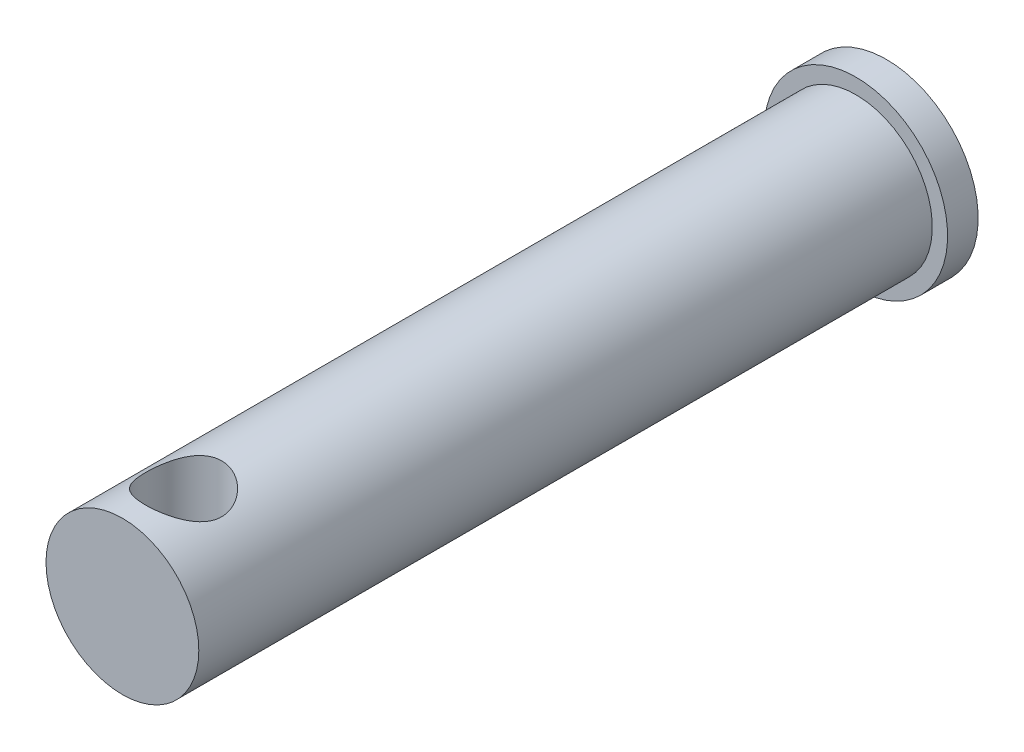
ISO-10303-21;
HEADER;
FILE_DESCRIPTION(('STEP AP214'),'2;1');
FILE_NAME('part.step','',(''),(''),'','','');
FILE_SCHEMA(('AUTOMOTIVE_DESIGN { 1 0 10303 214 1 1 1 1 }'));
ENDSEC;
DATA;
#1=APPLICATION_CONTEXT('core data for automotive mechanical design processes');
#2=APPLICATION_PROTOCOL_DEFINITION('international standard','automotive_design',2000,#1);
#3=PRODUCT_CONTEXT('',#1,'mechanical');
#4=PRODUCT('Part','Part','',(#3));
#5=PRODUCT_RELATED_PRODUCT_CATEGORY('part','',(#4));
#6=PRODUCT_DEFINITION_FORMATION('','',#4);
#7=PRODUCT_DEFINITION_CONTEXT('part definition',#1,'design');
#8=PRODUCT_DEFINITION('design','',#6,#7);
#9=PRODUCT_DEFINITION_SHAPE('','',#8);
#10=(LENGTH_UNIT() NAMED_UNIT(*) SI_UNIT(.MILLI.,.METRE.));
#11=(NAMED_UNIT(*) PLANE_ANGLE_UNIT() SI_UNIT($,.RADIAN.));
#12=(NAMED_UNIT(*) SI_UNIT($,.STERADIAN.) SOLID_ANGLE_UNIT());
#13=UNCERTAINTY_MEASURE_WITH_UNIT(LENGTH_MEASURE(1.E-05),#10,'distance_accuracy_value','');
#14=(GEOMETRIC_REPRESENTATION_CONTEXT(3) GLOBAL_UNCERTAINTY_ASSIGNED_CONTEXT((#13)) GLOBAL_UNIT_ASSIGNED_CONTEXT((#10,
#11,#12)) REPRESENTATION_CONTEXT('',''));
#15=CARTESIAN_POINT('',(0.,0.,0.));
#16=DIRECTION('',(0.,0.,1.));
#17=DIRECTION('',(1.,0.,0.));
#18=AXIS2_PLACEMENT_3D('',#15,#16,#17);
#19=CARTESIAN_POINT('',(0.,0.,3.175));
#20=DIRECTION('',(0.,0.,-1.));
#21=DIRECTION('',(-1.,0.,0.));
#22=AXIS2_PLACEMENT_3D('',#19,#20,#21);
#23=CYLINDRICAL_SURFACE('',#22,0.635);
#24=CARTESIAN_POINT('',(0.,0.,3.175));
#25=DIRECTION('',(0.,0.,1.));
#26=DIRECTION('',(1.,0.,0.));
#27=AXIS2_PLACEMENT_3D('',#24,#25,#26);
#28=CIRCLE('',#27,0.635);
#29=CARTESIAN_POINT('',(0.635,0.,3.175));
#30=VERTEX_POINT('',#29);
#31=EDGE_CURVE('E41',#30,#30,#28,.T.);
#32=ORIENTED_EDGE('',*,*,#31,.F.);
#33=EDGE_LOOP('',(#32));
#34=FACE_BOUND('',#33,.T.);
#35=CARTESIAN_POINT('',(0.,0.635,2.9845));
#36=CARTESIAN_POINT('',(-0.0166915982375732,0.634999090058179,2.98449895151356));
#37=CARTESIAN_POINT('',(-0.0334030954041254,0.634334808986968,2.98317600178387));
#38=CARTESIAN_POINT('',(-0.0663321746977251,0.631742945418733,2.97794271049176));
#39=CARTESIAN_POINT('',(-0.0825487575315375,0.629812963857023,2.97402745522325));
#40=CARTESIAN_POINT('',(-0.113961400499583,0.624891687105514,2.96380096576417));
#41=CARTESIAN_POINT('',(-0.12916115993319,0.621904519388627,2.95749904300126));
#42=CARTESIAN_POINT('',(-0.158265055836085,0.615142840437597,2.94272632771663));
#43=CARTESIAN_POINT('',(-0.172169294341841,0.611368391286458,2.93425570620099));
#44=CARTESIAN_POINT('',(-0.19923373213941,0.603111119969331,2.91480327328842));
#45=CARTESIAN_POINT('',(-0.212298029531271,0.598599257229926,2.90370054284141));
#46=CARTESIAN_POINT('',(-0.236467473745266,0.589470405533413,2.87955943033907));
#47=CARTESIAN_POINT('',(-0.247571127636399,0.584853339463686,2.86651958706225));
#48=CARTESIAN_POINT('',(-0.268367510142964,0.575624170051577,2.83766153652633));
#49=CARTESIAN_POINT('',(-0.277884044037645,0.571040218630168,2.82170628877517));
#50=CARTESIAN_POINT('',(-0.294058412037796,0.562882982602118,2.78816837082438));
#51=CARTESIAN_POINT('',(-0.300718288251811,0.559308976652192,2.77058687413053));
#52=CARTESIAN_POINT('',(-0.310557050394877,0.553903727845042,2.73536882902854));
#53=CARTESIAN_POINT('',(-0.31392045962304,0.55198096227829,2.7177985864686));
#54=CARTESIAN_POINT('',(-0.317635570375559,0.549852500586575,2.68224671900502));
#55=CARTESIAN_POINT('',(-0.317990248058451,0.549645107664939,2.66426551827341));
#56=CARTESIAN_POINT('',(-0.315813213677204,0.550897203566764,2.63071418727987));
#57=CARTESIAN_POINT('',(-0.313621597652941,0.552160324626893,2.61511287008668));
#58=CARTESIAN_POINT('',(-0.307003402075576,0.555867026229975,2.58453829377406));
#59=CARTESIAN_POINT('',(-0.302576110587505,0.55831098279089,2.56956523636556));
#60=CARTESIAN_POINT('',(-0.291531605272556,0.564157737610453,2.5402447504104));
#61=CARTESIAN_POINT('',(-0.284865783809329,0.567581544108195,2.52592001838551));
#62=CARTESIAN_POINT('',(-0.269570735834591,0.575003308593456,2.49852361210267));
#63=CARTESIAN_POINT('',(-0.260940627410459,0.579001524177105,2.48545250444697));
#64=CARTESIAN_POINT('',(-0.240685972434811,0.587734276342932,2.45918950225403));
#65=CARTESIAN_POINT('',(-0.228820490532247,0.592497895001669,2.44619244263957));
#66=CARTESIAN_POINT('',(-0.203058896250386,0.601813703978793,2.42229150459739));
#67=CARTESIAN_POINT('',(-0.189161818962336,0.606365792469193,2.41138862652924));
#68=CARTESIAN_POINT('',(-0.158913990601612,0.61500380962341,2.39150980262306));
#69=CARTESIAN_POINT('',(-0.142479265332813,0.619058274714373,2.38264684999848));
#70=CARTESIAN_POINT('',(-0.108098023417694,0.625976272559944,2.36788419327884));
#71=CARTESIAN_POINT('',(-0.0901527204642259,0.628840750645779,2.36198213625768));
#72=CARTESIAN_POINT('',(-0.0548533611022733,0.632854759629059,2.35379405931996));
#73=CARTESIAN_POINT('',(-0.0375734359490934,0.634126679106664,2.3512490326504));
#74=CARTESIAN_POINT('',(-0.00278752298392006,0.635231817732648,2.3490349478648));
#75=CARTESIAN_POINT('',(0.0147183538086935,0.635065718440167,2.34936452730947));
#76=CARTESIAN_POINT('',(0.0480164686055528,0.633384535404675,2.35274062357295));
#77=CARTESIAN_POINT('',(0.0638363620558603,0.631975005060002,2.35557457914178));
#78=CARTESIAN_POINT('',(0.0947441883058585,0.62808539392455,2.36354558782669));
#79=CARTESIAN_POINT('',(0.109832040206891,0.625605195111506,2.36868289484894));
#80=CARTESIAN_POINT('',(0.139347133182769,0.619709998238401,2.38124951309253));
#81=CARTESIAN_POINT('',(0.153743151049454,0.616270299619557,2.38874015841209));
#82=CARTESIAN_POINT('',(0.181121482339407,0.608787118456821,2.40573164256762));
#83=CARTESIAN_POINT('',(0.194103189953652,0.604743378921368,2.41523333773341));
#84=CARTESIAN_POINT('',(0.219636241349783,0.595973602746449,2.43705393504319));
#85=CARTESIAN_POINT('',(0.232020134709323,0.591219559393801,2.44955786073401));
#86=CARTESIAN_POINT('',(0.254589381953454,0.581858093342301,2.476476235528));
#87=CARTESIAN_POINT('',(0.264773214956842,0.577250773936346,2.4908919952242));
#88=CARTESIAN_POINT('',(0.283117262853019,0.568487535317766,2.5221068602086));
#89=CARTESIAN_POINT('',(0.291155594941468,0.564364281681524,2.53898757702123));
#90=CARTESIAN_POINT('',(0.304191297259383,0.5574476797688,2.57413444649238));
#91=CARTESIAN_POINT('',(0.309192585794304,0.554652618913962,2.59239877966413));
#92=CARTESIAN_POINT('',(0.315551085765273,0.551057765702517,2.62791899575851));
#93=CARTESIAN_POINT('',(0.317212026357275,0.550092192487059,2.64510337546372));
#94=CARTESIAN_POINT('',(0.3177188065159,0.549800001001605,2.67952444382671));
#95=CARTESIAN_POINT('',(0.316565866303247,0.550472672317479,2.69676110657477));
#96=CARTESIAN_POINT('',(0.311761544875544,0.553205212008828,2.72906601173641));
#97=CARTESIAN_POINT('',(0.308358639803839,0.5551268249816,2.74418439927085));
#98=CARTESIAN_POINT('',(0.299458176236325,0.559977976396638,2.77361907791734));
#99=CARTESIAN_POINT('',(0.29395994394324,0.56290783903372,2.7879351093142));
#100=CARTESIAN_POINT('',(0.280611499132967,0.569685583907376,2.81642339018825));
#101=CARTESIAN_POINT('',(0.272628086256726,0.573581918607905,2.83052135883093));
#102=CARTESIAN_POINT('',(0.254682933494632,0.581772177939824,2.85726966523734));
#103=CARTESIAN_POINT('',(0.244720164368271,0.586066308797607,2.86991924443962));
#104=CARTESIAN_POINT('',(0.221679556216024,0.595192876030818,2.89501007939854));
#105=CARTESIAN_POINT('',(0.20837030430573,0.600027322013913,2.90723926499991));
#106=CARTESIAN_POINT('',(0.179754150974939,0.609211863409903,2.929338497237));
#107=CARTESIAN_POINT('',(0.16444617963403,0.613561697080526,2.93920727226785));
#108=CARTESIAN_POINT('',(0.132058281990334,0.621341180432703,2.956317545177));
#109=CARTESIAN_POINT('',(0.11496659249924,0.624764106587236,2.96353997378813));
#110=CARTESIAN_POINT('',(0.0796106171609061,0.630241758829003,2.97491409331427));
#111=CARTESIAN_POINT('',(0.0613498263803555,0.632300371709059,2.97907451136839));
#112=CARTESIAN_POINT('',(0.0357511180084745,0.634033091563181,2.98256242801658));
#113=CARTESIAN_POINT('',(0.0286263967220409,0.634394734951965,2.9832879884742));
#114=CARTESIAN_POINT('',(0.0143356748487725,0.634878387904721,2.98425700630159));
#115=CARTESIAN_POINT('',(0.00716967312804358,0.635000390854448,2.98450045036461));
#116=CARTESIAN_POINT('',(0.,0.635,2.9845));
#117=B_SPLINE_CURVE_WITH_KNOTS('',3,(#35,#36,#37,#38,#39,#40,#41,#42,#43,#44,#45,#46,#47,#48,
#49,#50,#51,#52,#53,#54,#55,#56,#57,#58,#59,#60,#61,#62,#63,#64,#65,#66,#67,#68,#69,#70,#71,#72,
#73,#74,#75,#76,#77,#78,#79,#80,#81,#82,#83,#84,#85,#86,#87,#88,#89,#90,#91,#92,#93,#94,#95,#96,
#97,#98,#99,#100,#101,#102,#103,#104,#105,#106,#107,#108,#109,#110,#111,#112,#113,#114,#115,
#116),.UNSPECIFIED.,.T.,.F.,(4,2,2,2,2,2,2,2,2,2,2,2,2,2,2,2,2,2,2,2,2,2,2,2,2,2,2,2,2,2,2,2,2,
2,2,2,2,2,2,2,4),(0.,0.0500457017309429,0.10018653753267,0.150133734368805,0.200076993984648,
0.253041708392994,0.306046580455157,0.36316198141764,0.420236484577043,0.47389418854523,
0.52749880951964,0.574693136899593,0.621902502464029,0.670211512534947,0.718542255001204,
0.773001188735064,0.827486072350829,0.884501095530849,0.941470738696487,0.993721947246523,
1.04594839232394,1.09412692815694,1.14231077617821,1.19187231788858,1.24145500612598,
1.29590676379603,1.350396043854,1.40752411585697,1.46457832541197,1.51615555130734,
1.56771041505552,1.61435392852528,1.66101245388818,1.71080575026258,1.76062500661619,
1.81649764573918,1.87240031722062,1.92869824337979,1.98483508488415,2.00633101443719,
2.02782753728464),.UNSPECIFIED.);
#118=CARTESIAN_POINT('',(0.,0.635,2.9845));
#119=VERTEX_POINT('',#118);
#120=EDGE_CURVE('E50',#119,#119,#117,.T.);
#121=ORIENTED_EDGE('',*,*,#120,.T.);
#122=EDGE_LOOP('',(#121));
#123=FACE_BOUND('',#122,.T.);
#124=CARTESIAN_POINT('',(0.,-0.635,2.9845));
#125=CARTESIAN_POINT('',(0.0166915982375732,-0.634999090058179,2.98449895151356));
#126=CARTESIAN_POINT('',(0.0334030954041254,-0.634334808986968,2.98317600178387));
#127=CARTESIAN_POINT('',(0.066332174697725,-0.631742945418733,2.97794271049176));
#128=CARTESIAN_POINT('',(0.0825487575315374,-0.629812963857023,2.97402745522325));
#129=CARTESIAN_POINT('',(0.113961400499582,-0.624891687105514,2.96380096576417));
#130=CARTESIAN_POINT('',(0.12916115993319,-0.621904519388627,2.95749904300126));
#131=CARTESIAN_POINT('',(0.158265055836085,-0.615142840437597,2.94272632771663));
#132=CARTESIAN_POINT('',(0.172169294341841,-0.611368391286458,2.93425570620099));
#133=CARTESIAN_POINT('',(0.199233732139409,-0.603111119969331,2.91480327328842));
#134=CARTESIAN_POINT('',(0.212298029531271,-0.598599257229926,2.90370054284141));
#135=CARTESIAN_POINT('',(0.236467473745265,-0.589470405533413,2.87955943033907));
#136=CARTESIAN_POINT('',(0.247571127636398,-0.584853339463686,2.86651958706225));
#137=CARTESIAN_POINT('',(0.268367510142964,-0.575624170051577,2.83766153652633));
#138=CARTESIAN_POINT('',(0.277884044037645,-0.571040218630168,2.82170628877517));
#139=CARTESIAN_POINT('',(0.294058412037796,-0.562882982602118,2.78816837082438));
#140=CARTESIAN_POINT('',(0.300718288251811,-0.559308976652192,2.77058687413053));
#141=CARTESIAN_POINT('',(0.310557050394877,-0.553903727845042,2.73536882902854));
#142=CARTESIAN_POINT('',(0.31392045962304,-0.55198096227829,2.7177985864686));
#143=CARTESIAN_POINT('',(0.317635570375559,-0.549852500586575,2.68224671900502));
#144=CARTESIAN_POINT('',(0.317990248058451,-0.549645107664939,2.66426551827341));
#145=CARTESIAN_POINT('',(0.315813213677204,-0.550897203566764,2.63071418727987));
#146=CARTESIAN_POINT('',(0.313621597652941,-0.552160324626893,2.61511287008668));
#147=CARTESIAN_POINT('',(0.307003402075576,-0.555867026229975,2.58453829377406));
#148=CARTESIAN_POINT('',(0.302576110587505,-0.55831098279089,2.56956523636556));
#149=CARTESIAN_POINT('',(0.291531605272556,-0.564157737610453,2.5402447504104));
#150=CARTESIAN_POINT('',(0.284865783809328,-0.567581544108195,2.52592001838551));
#151=CARTESIAN_POINT('',(0.269570735834591,-0.575003308593457,2.49852361210267));
#152=CARTESIAN_POINT('',(0.260940627410459,-0.579001524177105,2.48545250444697));
#153=CARTESIAN_POINT('',(0.24068597243481,-0.587734276342933,2.45918950225403));
#154=CARTESIAN_POINT('',(0.228820490532247,-0.592497895001669,2.44619244263957));
#155=CARTESIAN_POINT('',(0.203058896250386,-0.601813703978793,2.42229150459739));
#156=CARTESIAN_POINT('',(0.189161818962336,-0.606365792469193,2.41138862652924));
#157=CARTESIAN_POINT('',(0.158913990601612,-0.61500380962341,2.39150980262306));
#158=CARTESIAN_POINT('',(0.142479265332812,-0.619058274714373,2.38264684999848));
#159=CARTESIAN_POINT('',(0.108098023417693,-0.625976272559944,2.36788419327884));
#160=CARTESIAN_POINT('',(0.0901527204642253,-0.628840750645779,2.36198213625768));
#161=CARTESIAN_POINT('',(0.0548533611022728,-0.632854759629059,2.35379405931996));
#162=CARTESIAN_POINT('',(0.0375734359490929,-0.634126679106664,2.3512490326504));
#163=CARTESIAN_POINT('',(0.00278752298391976,-0.635231817732648,2.3490349478648));
#164=CARTESIAN_POINT('',(-0.0147183538086937,-0.635065718440167,2.34936452730947));
#165=CARTESIAN_POINT('',(-0.048016468605553,-0.633384535404675,2.35274062357295));
#166=CARTESIAN_POINT('',(-0.0638363620558605,-0.631975005060002,2.35557457914178));
#167=CARTESIAN_POINT('',(-0.0947441883058587,-0.62808539392455,2.36354558782669));
#168=CARTESIAN_POINT('',(-0.109832040206892,-0.625605195111506,2.36868289484894));
#169=CARTESIAN_POINT('',(-0.139347133182769,-0.619709998238401,2.38124951309253));
#170=CARTESIAN_POINT('',(-0.153743151049454,-0.616270299619557,2.38874015841209));
#171=CARTESIAN_POINT('',(-0.181121482339407,-0.608787118456821,2.40573164256762));
#172=CARTESIAN_POINT('',(-0.194103189953652,-0.604743378921368,2.41523333773341));
#173=CARTESIAN_POINT('',(-0.219636241349783,-0.595973602746449,2.43705393504319));
#174=CARTESIAN_POINT('',(-0.232020134709323,-0.591219559393801,2.44955786073401));
#175=CARTESIAN_POINT('',(-0.254589381953454,-0.581858093342301,2.476476235528));
#176=CARTESIAN_POINT('',(-0.264773214956842,-0.577250773936346,2.4908919952242));
#177=CARTESIAN_POINT('',(-0.283117262853019,-0.568487535317766,2.5221068602086));
#178=CARTESIAN_POINT('',(-0.291155594941468,-0.564364281681524,2.53898757702123));
#179=CARTESIAN_POINT('',(-0.304191297259383,-0.557447679768801,2.57413444649238));
#180=CARTESIAN_POINT('',(-0.309192585794304,-0.554652618913962,2.59239877966413));
#181=CARTESIAN_POINT('',(-0.315551085765273,-0.551057765702517,2.62791899575851));
#182=CARTESIAN_POINT('',(-0.317212026357275,-0.550092192487059,2.64510337546372));
#183=CARTESIAN_POINT('',(-0.3177188065159,-0.549800001001605,2.67952444382671));
#184=CARTESIAN_POINT('',(-0.316565866303247,-0.550472672317479,2.69676110657477));
#185=CARTESIAN_POINT('',(-0.311761544875544,-0.553205212008828,2.72906601173641));
#186=CARTESIAN_POINT('',(-0.308358639803839,-0.5551268249816,2.74418439927085));
#187=CARTESIAN_POINT('',(-0.299458176236325,-0.559977976396638,2.77361907791734));
#188=CARTESIAN_POINT('',(-0.29395994394324,-0.56290783903372,2.7879351093142));
#189=CARTESIAN_POINT('',(-0.280611499132967,-0.569685583907376,2.81642339018825));
#190=CARTESIAN_POINT('',(-0.272628086256726,-0.573581918607905,2.83052135883093));
#191=CARTESIAN_POINT('',(-0.254682933494632,-0.581772177939824,2.85726966523734));
#192=CARTESIAN_POINT('',(-0.244720164368271,-0.586066308797607,2.86991924443962));
#193=CARTESIAN_POINT('',(-0.221679556216024,-0.595192876030819,2.89501007939854));
#194=CARTESIAN_POINT('',(-0.20837030430573,-0.600027322013913,2.90723926499991));
#195=CARTESIAN_POINT('',(-0.179754150974939,-0.609211863409903,2.929338497237));
#196=CARTESIAN_POINT('',(-0.16444617963403,-0.613561697080527,2.93920727226785));
#197=CARTESIAN_POINT('',(-0.132058281990334,-0.621341180432703,2.956317545177));
#198=CARTESIAN_POINT('',(-0.11496659249924,-0.624764106587236,2.96353997378813));
#199=CARTESIAN_POINT('',(-0.0796106171609059,-0.630241758829003,2.97491409331427));
#200=CARTESIAN_POINT('',(-0.0613498263803554,-0.632300371709059,2.97907451136839));
#201=CARTESIAN_POINT('',(-0.0357511180084744,-0.634033091563181,2.98256242801658));
#202=CARTESIAN_POINT('',(-0.0286263967220408,-0.634394734951965,2.9832879884742));
#203=CARTESIAN_POINT('',(-0.0143356748487725,-0.634878387904721,2.98425700630159));
#204=CARTESIAN_POINT('',(-0.00716967312804356,-0.635000390854448,2.98450045036461));
#205=CARTESIAN_POINT('',(0.,-0.635,2.9845));
#206=B_SPLINE_CURVE_WITH_KNOTS('',3,(#124,#125,#126,#127,#128,#129,#130,#131,#132,#133,#134,
#135,#136,#137,#138,#139,#140,#141,#142,#143,#144,#145,#146,#147,#148,#149,#150,#151,#152,#153,
#154,#155,#156,#157,#158,#159,#160,#161,#162,#163,#164,#165,#166,#167,#168,#169,#170,#171,#172,
#173,#174,#175,#176,#177,#178,#179,#180,#181,#182,#183,#184,#185,#186,#187,#188,#189,#190,#191,
#192,#193,#194,#195,#196,#197,#198,#199,#200,#201,#202,#203,#204,#205),.UNSPECIFIED.,.T.,.F.,(4,
2,2,2,2,2,2,2,2,2,2,2,2,2,2,2,2,2,2,2,2,2,2,2,2,2,2,2,2,2,2,2,2,2,2,2,2,2,2,2,4),(0.,
0.0500457017309429,0.10018653753267,0.150133734368805,0.200076993984648,0.253041708392993,
0.306046580455156,0.36316198141764,0.420236484577042,0.473894188545229,0.52749880951964,
0.574693136899593,0.62190250246403,0.670211512534948,0.718542255001205,0.773001188735065,
0.82748607235083,0.88450109553085,0.941470738696488,0.993721947246523,1.04594839232394,
1.09412692815694,1.14231077617821,1.19187231788858,1.24145500612598,1.29590676379603,
1.350396043854,1.40752411585697,1.46457832541197,1.51615555130734,1.56771041505552,
1.61435392852528,1.66101245388818,1.71080575026258,1.76062500661619,1.81649764573918,
1.87240031722062,1.92869824337979,1.98483508488415,2.00633101443719,2.02782753728464),.UNSPECIFIED.);
#207=CARTESIAN_POINT('',(0.,-0.635,2.9845));
#208=VERTEX_POINT('',#207);
#209=EDGE_CURVE('E45',#208,#208,#206,.T.);
#210=ORIENTED_EDGE('',*,*,#209,.T.);
#211=EDGE_LOOP('',(#210));
#212=FACE_BOUND('',#211,.T.);
#213=CARTESIAN_POINT('',(0.,0.,-2.921));
#214=DIRECTION('',(0.,0.,-1.));
#215=DIRECTION('',(-1.,0.,0.));
#216=AXIS2_PLACEMENT_3D('',#213,#214,#215);
#217=CIRCLE('',#216,0.635);
#218=CARTESIAN_POINT('',(-0.635,0.,-2.921));
#219=VERTEX_POINT('',#218);
#220=EDGE_CURVE('E10',#219,#219,#217,.T.);
#221=ORIENTED_EDGE('',*,*,#220,.F.);
#222=EDGE_LOOP('',(#221));
#223=FACE_BOUND('',#222,.T.);
#224=ADVANCED_FACE('F34',(#34,#123,#212,#223),#23,.T.);
#225=CARTESIAN_POINT('',(0.,0.,3.175));
#226=DIRECTION('',(0.,0.,1.));
#227=DIRECTION('',(1.,0.,0.));
#228=AXIS2_PLACEMENT_3D('',#225,#226,#227);
#229=PLANE('',#228);
#230=ORIENTED_EDGE('',*,*,#31,.T.);
#231=EDGE_LOOP('',(#230));
#232=FACE_BOUND('',#231,.T.);
#233=ADVANCED_FACE('F70',(#232),#229,.T.);
#234=CARTESIAN_POINT('',(0.,-1.524,2.667));
#235=DIRECTION('',(0.,1.,0.));
#236=DIRECTION('',(0.,0.,1.));
#237=AXIS2_PLACEMENT_3D('',#234,#235,#236);
#238=CYLINDRICAL_SURFACE('',#237,0.3175);
#239=ORIENTED_EDGE('',*,*,#120,.F.);
#240=EDGE_LOOP('',(#239));
#241=FACE_BOUND('',#240,.T.);
#242=ORIENTED_EDGE('',*,*,#209,.F.);
#243=EDGE_LOOP('',(#242));
#244=FACE_BOUND('',#243,.T.);
#245=ADVANCED_FACE('F64',(#241,#244),#238,.F.);
#246=CARTESIAN_POINT('',(0.,0.,-2.921));
#247=DIRECTION('',(0.,0.,-1.));
#248=DIRECTION('',(-1.,0.,0.));
#249=AXIS2_PLACEMENT_3D('',#246,#247,#248);
#250=CYLINDRICAL_SURFACE('',#249,0.762);
#251=CARTESIAN_POINT('',(0.,0.,-2.921));
#252=DIRECTION('',(0.,0.,-1.));
#253=DIRECTION('',(-1.,0.,0.));
#254=AXIS2_PLACEMENT_3D('',#251,#252,#253);
#255=CIRCLE('',#254,0.762);
#256=CARTESIAN_POINT('',(-0.762,0.,-2.921));
#257=VERTEX_POINT('',#256);
#258=EDGE_CURVE('E60',#257,#257,#255,.T.);
#259=ORIENTED_EDGE('',*,*,#258,.T.);
#260=EDGE_LOOP('',(#259));
#261=FACE_BOUND('',#260,.T.);
#262=CARTESIAN_POINT('',(0.,0.,-3.175));
#263=DIRECTION('',(0.,0.,-1.));
#264=DIRECTION('',(-1.,0.,0.));
#265=AXIS2_PLACEMENT_3D('',#262,#263,#264);
#266=CIRCLE('',#265,0.762);
#267=CARTESIAN_POINT('',(-0.762,0.,-3.175));
#268=VERTEX_POINT('',#267);
#269=EDGE_CURVE('E53',#268,#268,#266,.T.);
#270=ORIENTED_EDGE('',*,*,#269,.F.);
#271=EDGE_LOOP('',(#270));
#272=FACE_BOUND('',#271,.T.);
#273=ADVANCED_FACE('F69',(#261,#272),#250,.T.);
#274=CARTESIAN_POINT('',(0.,0.,-2.921));
#275=DIRECTION('',(0.,0.,-1.));
#276=DIRECTION('',(-1.,0.,0.));
#277=AXIS2_PLACEMENT_3D('',#274,#275,#276);
#278=PLANE('',#277);
#279=ORIENTED_EDGE('',*,*,#220,.T.);
#280=EDGE_LOOP('',(#279));
#281=FACE_BOUND('',#280,.T.);
#282=ORIENTED_EDGE('',*,*,#258,.F.);
#283=EDGE_LOOP('',(#282));
#284=FACE_BOUND('',#283,.T.);
#285=ADVANCED_FACE('F77',(#281,#284),#278,.F.);
#286=CARTESIAN_POINT('',(0.,0.,-3.175));
#287=DIRECTION('',(0.,0.,1.));
#288=DIRECTION('',(1.,0.,0.));
#289=AXIS2_PLACEMENT_3D('',#286,#287,#288);
#290=PLANE('',#289);
#291=ORIENTED_EDGE('',*,*,#269,.T.);
#292=EDGE_LOOP('',(#291));
#293=FACE_BOUND('',#292,.T.);
#294=ADVANCED_FACE('F75',(#293),#290,.F.);
#295=CLOSED_SHELL('',(#224,#233,#245,#273,#285,#294));
#296=MANIFOLD_SOLID_BREP('B2',#295);
#297=ADVANCED_BREP_SHAPE_REPRESENTATION('',(#18,#296),#14);
#298=SHAPE_DEFINITION_REPRESENTATION(#9,#297);
ENDSEC;
END-ISO-10303-21;
